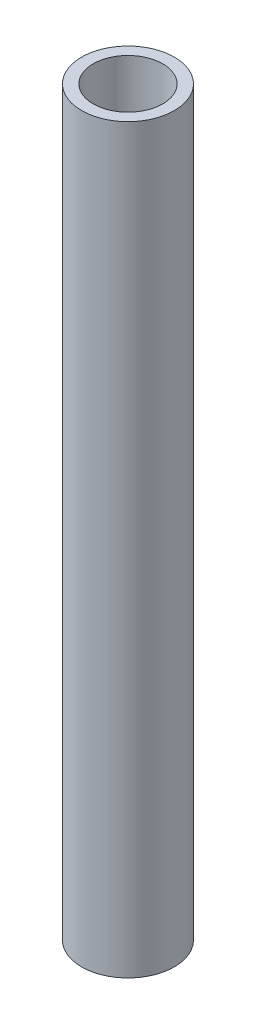
ISO-10303-21;
HEADER;
FILE_DESCRIPTION(('STEP AP214'),'2;1');
FILE_NAME('part.step','',(''),(''),'','','');
FILE_SCHEMA(('AUTOMOTIVE_DESIGN { 1 0 10303 214 1 1 1 1 }'));
ENDSEC;
DATA;
#1=APPLICATION_CONTEXT('core data for automotive mechanical design processes');
#2=APPLICATION_PROTOCOL_DEFINITION('international standard','automotive_design',2000,#1);
#3=PRODUCT_CONTEXT('',#1,'mechanical');
#4=PRODUCT('Part','Part','',(#3));
#5=PRODUCT_RELATED_PRODUCT_CATEGORY('part','',(#4));
#6=PRODUCT_DEFINITION_FORMATION('','',#4);
#7=PRODUCT_DEFINITION_CONTEXT('part definition',#1,'design');
#8=PRODUCT_DEFINITION('design','',#6,#7);
#9=PRODUCT_DEFINITION_SHAPE('','',#8);
#10=(LENGTH_UNIT() NAMED_UNIT(*) SI_UNIT(.MILLI.,.METRE.));
#11=(NAMED_UNIT(*) PLANE_ANGLE_UNIT() SI_UNIT($,.RADIAN.));
#12=(NAMED_UNIT(*) SI_UNIT($,.STERADIAN.) SOLID_ANGLE_UNIT());
#13=UNCERTAINTY_MEASURE_WITH_UNIT(LENGTH_MEASURE(1.E-05),#10,'distance_accuracy_value','');
#14=(GEOMETRIC_REPRESENTATION_CONTEXT(3) GLOBAL_UNCERTAINTY_ASSIGNED_CONTEXT((#13)) GLOBAL_UNIT_ASSIGNED_CONTEXT((#10,
#11,#12)) REPRESENTATION_CONTEXT('',''));
#15=CARTESIAN_POINT('',(0.,0.,0.));
#16=DIRECTION('',(0.,0.,1.));
#17=DIRECTION('',(1.,0.,0.));
#18=AXIS2_PLACEMENT_3D('',#15,#16,#17);
#19=CARTESIAN_POINT('',(0.,50.8,0.));
#20=DIRECTION('',(0.,1.,0.));
#21=DIRECTION('',(0.,0.,1.));
#22=AXIS2_PLACEMENT_3D('',#19,#20,#21);
#23=PLANE('',#22);
#24=CARTESIAN_POINT('',(0.,50.8,0.));
#25=DIRECTION('',(0.,1.,0.));
#26=DIRECTION('',(0.,0.,1.));
#27=AXIS2_PLACEMENT_3D('',#24,#25,#26);
#28=CIRCLE('',#27,3.175);
#29=CARTESIAN_POINT('',(0.,50.8,3.175));
#30=VERTEX_POINT('',#29);
#31=EDGE_CURVE('E43',#30,#30,#28,.T.);
#32=ORIENTED_EDGE('',*,*,#31,.T.);
#33=EDGE_LOOP('',(#32));
#34=FACE_BOUND('',#33,.T.);
#35=CARTESIAN_POINT('',(0.,50.8,0.));
#36=DIRECTION('',(0.,1.,0.));
#37=DIRECTION('',(0.,0.,1.));
#38=AXIS2_PLACEMENT_3D('',#35,#36,#37);
#39=CIRCLE('',#38,2.38125);
#40=CARTESIAN_POINT('',(0.,50.8,2.38125));
#41=VERTEX_POINT('',#40);
#42=EDGE_CURVE('E52',#41,#41,#39,.T.);
#43=ORIENTED_EDGE('',*,*,#42,.F.);
#44=EDGE_LOOP('',(#43));
#45=FACE_BOUND('',#44,.T.);
#46=ADVANCED_FACE('F32',(#34,#45),#23,.T.);
#47=CARTESIAN_POINT('',(0.,0.,0.));
#48=DIRECTION('',(0.,1.,0.));
#49=DIRECTION('',(0.,0.,1.));
#50=AXIS2_PLACEMENT_3D('',#47,#48,#49);
#51=PLANE('',#50);
#52=CARTESIAN_POINT('',(0.,0.,0.));
#53=DIRECTION('',(0.,1.,0.));
#54=DIRECTION('',(0.,0.,1.));
#55=AXIS2_PLACEMENT_3D('',#52,#53,#54);
#56=CIRCLE('',#55,3.175);
#57=CARTESIAN_POINT('',(0.,0.,3.175));
#58=VERTEX_POINT('',#57);
#59=EDGE_CURVE('E47',#58,#58,#56,.T.);
#60=ORIENTED_EDGE('',*,*,#59,.F.);
#61=EDGE_LOOP('',(#60));
#62=FACE_BOUND('',#61,.T.);
#63=CARTESIAN_POINT('',(0.,0.,0.));
#64=DIRECTION('',(0.,1.,0.));
#65=DIRECTION('',(0.,0.,1.));
#66=AXIS2_PLACEMENT_3D('',#63,#64,#65);
#67=CIRCLE('',#66,2.38125);
#68=CARTESIAN_POINT('',(0.,0.,2.38125));
#69=VERTEX_POINT('',#68);
#70=EDGE_CURVE('E54',#69,#69,#67,.T.);
#71=ORIENTED_EDGE('',*,*,#70,.T.);
#72=EDGE_LOOP('',(#71));
#73=FACE_BOUND('',#72,.T.);
#74=ADVANCED_FACE('F78',(#62,#73),#51,.F.);
#75=CARTESIAN_POINT('',(0.,50.8,0.));
#76=DIRECTION('',(0.,-1.,0.));
#77=DIRECTION('',(0.,0.,-1.));
#78=AXIS2_PLACEMENT_3D('',#75,#76,#77);
#79=CYLINDRICAL_SURFACE('',#78,3.175);
#80=CARTESIAN_POINT('',(-2.74882770949687,3.17502462022635,1.58888993435739));
#81=CARTESIAN_POINT('',(-2.74883491921362,3.09230347471639,1.5888841643825));
#82=CARTESIAN_POINT('',(-2.75262068652012,3.00947787943034,1.5823830546891));
#83=CARTESIAN_POINT('',(-2.76721589163253,2.84636883755137,1.55670982251439));
#84=CARTESIAN_POINT('',(-2.7780400875779,2.76609110509494,1.53751107424158));
#85=CARTESIAN_POINT('',(-2.80514420858386,2.61074510308035,1.48747706202258));
#86=CARTESIAN_POINT('',(-2.82139508162169,2.53565160942453,1.45670365510467));
#87=CARTESIAN_POINT('',(-2.85747766275996,2.39171369955656,1.38458203519406));
#88=CARTESIAN_POINT('',(-2.87730956456201,2.3228696216847,1.34323325011768));
#89=CARTESIAN_POINT('',(-2.9203201526704,2.18711427614131,1.24713472561136));
#90=CARTESIAN_POINT('',(-2.94363996616437,2.1208307423446,1.1915609826474));
#91=CARTESIAN_POINT('',(-2.98986449365632,1.9980388036307,1.0703021492032));
#92=CARTESIAN_POINT('',(-3.01276899553175,1.94153527462502,1.00461204578224));
#93=CARTESIAN_POINT('',(-3.05743176100581,1.83617926777944,0.859573044746663));
#94=CARTESIAN_POINT('',(-3.0790086877116,1.78809926374935,0.779601923860705));
#95=CARTESIAN_POINT('',(-3.11675953177772,1.70636351569871,0.611425105319753));
#96=CARTESIAN_POINT('',(-3.13293685752017,1.6726986686086,0.523224647423842));
#97=CARTESIAN_POINT('',(-3.15705191672915,1.62323597041086,0.347742511092332));
#98=CARTESIAN_POINT('',(-3.1654940285523,1.60633724713695,0.260842012003152));
#99=CARTESIAN_POINT('',(-3.17507779478834,1.58726090682973,0.0850611154821416));
#100=CARTESIAN_POINT('',(-3.17622386643338,1.58507438256317,-0.00381805128939768));
#101=CARTESIAN_POINT('',(-3.17132508379108,1.59505996515429,-0.172755820314771));
#102=CARTESIAN_POINT('',(-3.16589689086841,1.6059999698663,-0.252909346073254));
#103=CARTESIAN_POINT('',(-3.14939886525141,1.639722959925,-0.410068416331271));
#104=CARTESIAN_POINT('',(-3.13832861039716,1.66250683147611,-0.487073724803752));
#105=CARTESIAN_POINT('',(-3.11137137904733,1.71941819389394,-0.637093217187457));
#106=CARTESIAN_POINT('',(-3.09541988017657,1.75369826738701,-0.710037441860359));
#107=CARTESIAN_POINT('',(-3.06013991189908,1.83241779344623,-0.849316158809075));
#108=CARTESIAN_POINT('',(-3.04081023407293,1.87686088321884,-0.915648272466085));
#109=CARTESIAN_POINT('',(-2.99843423076338,1.97947099078502,-1.04650989497068));
#110=CARTESIAN_POINT('',(-2.97520929921116,2.0385381776939,-1.11027630243667));
#111=CARTESIAN_POINT('',(-2.92883357574234,2.16631080855301,-1.22741010742885));
#112=CARTESIAN_POINT('',(-2.90568285422064,2.23502359871143,-1.2807695041394));
#113=CARTESIAN_POINT('',(-2.86048597408261,2.38547862569959,-1.37889371234333));
#114=CARTESIAN_POINT('',(-2.83860332029404,2.46777118182492,-1.42289755001501));
#115=CARTESIAN_POINT('',(-2.80071701958443,2.63993817350876,-1.49610331799885));
#116=CARTESIAN_POINT('',(-2.78470724284475,2.72980458264173,-1.52532069385372));
#117=CARTESIAN_POINT('',(-2.76216304768593,2.90707765688778,-1.56575231183522));
#118=CARTESIAN_POINT('',(-2.75497828789955,2.99411489670799,-1.57820974220642));
#119=CARTESIAN_POINT('',(-2.74905043224157,3.16931174988386,-1.58851851186402));
#120=CARTESIAN_POINT('',(-2.7503013733165,3.25747052645402,-1.58638016864147));
#121=CARTESIAN_POINT('',(-2.76041353637987,3.42212521597008,-1.56869933052269));
#122=CARTESIAN_POINT('',(-2.76842729288886,3.49884199886019,-1.55464871741576));
#123=CARTESIAN_POINT('',(-2.78990927379191,3.6486834809315,-1.51575754457271));
#124=CARTESIAN_POINT('',(-2.80337926449891,3.72180700828659,-1.49091349055369));
#125=CARTESIAN_POINT('',(-2.83498582213927,3.86624010803438,-1.42993243920374));
#126=CARTESIAN_POINT('',(-2.85330962809472,3.93730880948136,-1.39332569971757));
#127=CARTESIAN_POINT('',(-2.89239120223534,4.0727070887945,-1.3102685685522));
#128=CARTESIAN_POINT('',(-2.91315021829215,4.13703317930369,-1.26381312018282));
#129=CARTESIAN_POINT('',(-2.95790655941964,4.26560341366998,-1.15553371482659));
#130=CARTESIAN_POINT('',(-2.98198223185818,4.32881509699063,-1.09251065164959));
#131=CARTESIAN_POINT('',(-3.02838988340399,4.44409154804117,-0.956373688470212));
#132=CARTESIAN_POINT('',(-3.05072127189845,4.49615255046733,-0.883256393563637));
#133=CARTESIAN_POINT('',(-3.09188674044136,4.58881041017213,-0.726361808436089));
#134=CARTESIAN_POINT('',(-3.1106129655641,4.62906844538617,-0.642354109574931));
#135=CARTESIAN_POINT('',(-3.14163504360348,4.69448104259996,-0.467553489798921));
#136=CARTESIAN_POINT('',(-3.15393654172063,4.71964886677036,-0.376766605991209));
#137=CARTESIAN_POINT('',(-3.16982320069078,4.75199721585362,-0.199977696281177));
#138=CARTESIAN_POINT('',(-3.17410454859489,4.76061624817968,-0.114300942213469));
#139=CARTESIAN_POINT('',(-3.17564022186957,4.76386330413521,0.0573680259302063));
#140=CARTESIAN_POINT('',(-3.17289700715075,4.7584962255075,0.143360119047536));
#141=CARTESIAN_POINT('',(-3.16109682104474,4.73487607443829,0.307252265230391));
#142=CARTESIAN_POINT('',(-3.15246780257241,4.71749542202979,0.385312154335311));
#143=CARTESIAN_POINT('',(-3.13015325402427,4.67151800883288,0.537278036704094));
#144=CARTESIAN_POINT('',(-3.11646699882652,4.64291963957799,0.611183432532456));
#145=CARTESIAN_POINT('',(-3.08454218339078,4.57404542491286,0.756294213320669));
#146=CARTESIAN_POINT('',(-3.06613395570349,4.5333224446339,0.827248922320375));
#147=CARTESIAN_POINT('',(-3.02668833697277,4.4419164049876,0.961610076721102));
#148=CARTESIAN_POINT('',(-3.00564973998932,4.39122877100521,1.02501303368252));
#149=CARTESIAN_POINT('',(-2.96056110094025,4.27548416202781,1.14912290630251));
#150=CARTESIAN_POINT('',(-2.93641973120936,4.2094991713563,1.20893355134433));
#151=CARTESIAN_POINT('',(-2.88958588277424,4.06807160043283,1.31696403178478));
#152=CARTESIAN_POINT('',(-2.86689469882726,3.9926207420989,1.3651736128127));
#153=CARTESIAN_POINT('',(-2.82501105944426,3.83123894377908,1.44991277195113));
#154=CARTESIAN_POINT('',(-2.80595183171966,3.74505216455948,1.48602509380099));
#155=CARTESIAN_POINT('',(-2.77522065345828,3.56660942833695,1.54267322333504));
#156=CARTESIAN_POINT('',(-2.76352401792065,3.47437490907746,1.56326112712008));
#157=CARTESIAN_POINT('',(-2.75397877539454,3.3467836181288,1.57995016243613));
#158=CARTESIAN_POINT('',(-2.75205392829055,3.31255308786971,1.58329738135979));
#159=CARTESIAN_POINT('',(-2.74947685172674,3.24389595714329,1.58776854298275));
#160=CARTESIAN_POINT('',(-2.74882470740232,3.20946934371377,1.58889233694971));
#161=CARTESIAN_POINT('',(-2.74882770949687,3.17502462022635,1.58888993435739));
#162=B_SPLINE_CURVE_WITH_KNOTS('',3,(#80,#81,#82,#83,#84,#85,#86,#87,#88,#89,#90,#91,#92,#93,
#94,#95,#96,#97,#98,#99,#100,#101,#102,#103,#104,#105,#106,#107,#108,#109,#110,#111,#112,#113,
#114,#115,#116,#117,#118,#119,#120,#121,#122,#123,#124,#125,#126,#127,#128,#129,#130,#131,#132,
#133,#134,#135,#136,#137,#138,#139,#140,#141,#142,#143,#144,#145,#146,#147,#148,#149,#150,#151,
#152,#153,#154,#155,#156,#157,#158,#159,#160,#161),.UNSPECIFIED.,.T.,.F.,(4,2,2,2,2,2,2,2,2,2,2,
2,2,2,2,2,2,2,2,2,2,2,2,2,2,2,2,2,2,2,2,2,2,2,2,2,2,2,2,2,4),(0.,0.24801849461911,
0.496558717359376,0.743789146021229,0.991032951644172,1.25866892109094,1.52643794096439,
1.81225653929036,2.09789437805176,2.36320782386596,2.62836062601588,2.87045554756704,
3.11256858621459,3.35803136385694,3.60358212718556,3.87234416437813,4.14131201590394,
4.42736036245498,4.7131092906108,4.9762138673106,5.23913247936541,5.47329016185639,
5.70752370742248,5.95260583044662,6.19781409374323,6.47393205434221,6.75014310652894,
7.03364387993081,7.31689512946423,7.57415729243308,7.83132937785428,8.07155524483492,
8.31181556950318,8.56235191767159,8.81300355284889,9.08860008936979,9.36443934266679,
9.64899564098782,9.93259273641879,10.0358596460668,10.1391334633508),.UNSPECIFIED.);
#163=CARTESIAN_POINT('',(-2.74882770949687,3.17502462022635,1.58888993435739));
#164=VERTEX_POINT('',#163);
#165=EDGE_CURVE('E10',#164,#164,#162,.T.);
#166=ORIENTED_EDGE('',*,*,#165,.T.);
#167=EDGE_LOOP('',(#166));
#168=FACE_BOUND('',#167,.T.);
#169=ORIENTED_EDGE('',*,*,#31,.F.);
#170=EDGE_LOOP('',(#169));
#171=FACE_BOUND('',#170,.T.);
#172=ORIENTED_EDGE('',*,*,#59,.T.);
#173=EDGE_LOOP('',(#172));
#174=FACE_BOUND('',#173,.T.);
#175=ADVANCED_FACE('F34',(#168,#171,#174),#79,.T.);
#176=CARTESIAN_POINT('',(0.,50.8,0.));
#177=DIRECTION('',(0.,-1.,0.));
#178=DIRECTION('',(0.,0.,-1.));
#179=AXIS2_PLACEMENT_3D('',#176,#177,#178);
#180=CYLINDRICAL_SURFACE('',#179,2.38125);
#181=CARTESIAN_POINT('',(-1.77407613419667,3.17502462022635,1.58839712684637));
#182=CARTESIAN_POINT('',(-1.77408372235744,3.09753214847438,1.58839279678917));
#183=CARTESIAN_POINT('',(-1.77924850872367,3.02001258446999,1.58267674412269));
#184=CARTESIAN_POINT('',(-1.79889641851791,2.86774819035352,1.5602971764767));
#185=CARTESIAN_POINT('',(-1.81339625588081,2.79300859202476,1.54361402433063));
#186=CARTESIAN_POINT('',(-1.84912821763252,2.64897836323594,1.5006134619442));
#187=CARTESIAN_POINT('',(-1.87029472516054,2.57964251094084,1.47438958197332));
#188=CARTESIAN_POINT('',(-1.91685946075183,2.44646861580119,1.41332048339744));
#189=CARTESIAN_POINT('',(-1.94225856728098,2.38263171843253,1.37847347435283));
#190=CARTESIAN_POINT('',(-1.99916757281533,2.25137990318043,1.2948425187742));
#191=CARTESIAN_POINT('',(-2.03101326193804,2.18495475178833,1.24473350213208));
#192=CARTESIAN_POINT('',(-2.09448866825353,2.06059747005739,1.13468661727198));
#193=CARTESIAN_POINT('',(-2.12611814366962,2.0026737124099,1.07473918100035));
#194=CARTESIAN_POINT('',(-2.19098192488538,1.88863871606841,0.936269862843662));
#195=CARTESIAN_POINT('',(-2.22378809229139,1.83399787650442,0.856315756696874));
#196=CARTESIAN_POINT('',(-2.28214907095415,1.73941495693111,0.685740206959136));
#197=CARTESIAN_POINT('',(-2.30771197581846,1.6994564559641,0.595130831088971));
#198=CARTESIAN_POINT('',(-2.34611398680121,1.64026422691875,0.416515135676053));
#199=CARTESIAN_POINT('',(-2.36005874425882,1.61920846553301,0.329357035658943));
#200=CARTESIAN_POINT('',(-2.37807592625733,1.59214068185746,0.151773071269095));
#201=CARTESIAN_POINT('',(-2.38216078357675,1.58610971384116,0.0613514682452848));
#202=CARTESIAN_POINT('',(-2.38015546244527,1.58924900237342,-0.105275893777436));
#203=CARTESIAN_POINT('',(-2.37551806926099,1.59624717970927,-0.181552533361043));
#204=CARTESIAN_POINT('',(-2.35925788904843,1.62093439224249,-0.331577931971545));
#205=CARTESIAN_POINT('',(-2.34763459258016,1.63862420711729,-0.40532650622719));
#206=CARTESIAN_POINT('',(-2.31844091116387,1.68372369503205,-0.548164793454911));
#207=CARTESIAN_POINT('',(-2.30089417607364,1.71109473535271,-0.617271743082294));
#208=CARTESIAN_POINT('',(-2.26114693974294,1.77449532432016,-0.749910435791092));
#209=CARTESIAN_POINT('',(-2.23894558910415,1.81052645348068,-0.813441158287724));
#210=CARTESIAN_POINT('',(-2.18819491553419,1.89548274308515,-0.942094486293836));
#211=CARTESIAN_POINT('',(-2.15919479297649,1.94548009188763,-1.00632923745881));
#212=CARTESIAN_POINT('',(-2.09924934724042,2.05416919706386,-1.12605435599633));
#213=CARTESIAN_POINT('',(-2.06830106669025,2.11287436481132,-1.18153095747427));
#214=CARTESIAN_POINT('',(-2.00209392777207,2.24789541833315,-1.29099257955344));
#215=CARTESIAN_POINT('',(-1.966911856719,2.32553041474972,-1.34340865087378));
#216=CARTESIAN_POINT('',(-1.90156310487852,2.4904230551078,-1.43441562546621));
#217=CARTESIAN_POINT('',(-1.87138806132098,2.57766424079242,-1.4730297080124));
#218=CARTESIAN_POINT('',(-1.82848312696035,2.73427037574686,-1.52571676572806));
#219=CARTESIAN_POINT('',(-1.81323230126476,2.80163935770893,-1.54364788665489));
#220=CARTESIAN_POINT('',(-1.78997851277605,2.93931221526854,-1.57055795948681));
#221=CARTESIAN_POINT('',(-1.78196298523822,3.00961078034487,-1.5795524334288));
#222=CARTESIAN_POINT('',(-1.77441807295771,3.15156374071404,-1.58802709491323));
#223=CARTESIAN_POINT('',(-1.77492560577427,3.22322269067578,-1.5874658919811));
#224=CARTESIAN_POINT('',(-1.78443207402888,3.36527366342909,-1.57676847786307));
#225=CARTESIAN_POINT('',(-1.79343789256738,3.43566461211503,-1.5666245052026));
#226=CARTESIAN_POINT('',(-1.81789370536617,3.56982747040327,-1.53816087108084));
#227=CARTESIAN_POINT('',(-1.83300726062008,3.63375473923523,-1.52026498684089));
#228=CARTESIAN_POINT('',(-1.8678848666375,3.7577373201032,-1.47720123075545));
#229=CARTESIAN_POINT('',(-1.88765047879096,3.81779132349768,-1.45203091671372));
#230=CARTESIAN_POINT('',(-1.93436883122367,3.94512246072415,-1.38938127784983));
#231=CARTESIAN_POINT('',(-1.96196845923467,4.01144408916549,-1.3504472345368));
#232=CARTESIAN_POINT('',(-2.01884793360423,4.13738045707575,-1.2638417943323));
#233=CARTESIAN_POINT('',(-2.04812979552419,4.19698688657431,-1.21615975951799));
#234=CARTESIAN_POINT('',(-2.11253273578583,4.32116973361042,-1.1012655731103));
#235=CARTESIAN_POINT('',(-2.14753208297881,4.38398750604518,-1.03206246698547));
#236=CARTESIAN_POINT('',(-2.21322758281104,4.4972666122885,-0.882403885241281));
#237=CARTESIAN_POINT('',(-2.24392752720998,4.54773886365614,-0.801958451257106));
#238=CARTESIAN_POINT('',(-2.29260490677178,4.62591368799642,-0.647721688257226));
#239=CARTESIAN_POINT('',(-2.31189338651938,4.65612759562702,-0.575619496312039));
#240=CARTESIAN_POINT('',(-2.34399064632864,4.70585658071706,-0.426453429107375));
#241=CARTESIAN_POINT('',(-2.35680489841266,4.72538069437098,-0.349393806192005));
#242=CARTESIAN_POINT('',(-2.37482562463077,4.75275908527366,-0.191973833494871));
#243=CARTESIAN_POINT('',(-2.37999823617056,4.76056142208485,-0.111600404761654));
#244=CARTESIAN_POINT('',(-2.38209697876668,4.76383260228859,0.0495084188015385));
#245=CARTESIAN_POINT('',(-2.3790238763419,4.75930259209154,0.130243779289931));
#246=CARTESIAN_POINT('',(-2.36546653343491,4.73898240082888,0.283578492168532));
#247=CARTESIAN_POINT('',(-2.35553740693559,4.72403490099229,0.35634258494409));
#248=CARTESIAN_POINT('',(-2.32969132527094,4.68454820024056,0.498080014435713));
#249=CARTESIAN_POINT('',(-2.3137734399357,4.66000750929445,0.5670527603741));
#250=CARTESIAN_POINT('',(-2.27605413972855,4.60064827322465,0.703736466669794));
#251=CARTESIAN_POINT('',(-2.25396558274298,4.56531718865212,0.771143490165616));
#252=CARTESIAN_POINT('',(-2.20597543100019,4.48618004605447,0.899285321125462));
#253=CARTESIAN_POINT('',(-2.18007155688858,4.44236891691444,0.960016101914287));
#254=CARTESIAN_POINT('',(-2.12188403499124,4.33975042899689,1.08318769306236));
#255=CARTESIAN_POINT('',(-2.08923775884736,4.27966822018507,1.14439517584484));
#256=CARTESIAN_POINT('',(-2.02385107451584,4.15045324662433,1.25641854058354));
#257=CARTESIAN_POINT('',(-1.9911106143271,4.08131377408928,1.30722664861637));
#258=CARTESIAN_POINT('',(-1.93115761720398,3.94030472006433,1.39411296787398));
#259=CARTESIAN_POINT('',(-1.90371388539864,3.86904643357825,1.43101953274284));
#260=CARTESIAN_POINT('',(-1.85461565170209,3.72010508883802,1.49410701442527));
#261=CARTESIAN_POINT('',(-1.83294993157845,3.64243486947326,1.52030876846695));
#262=CARTESIAN_POINT('',(-1.80254245581065,3.49984976716436,1.5561555978739));
#263=CARTESIAN_POINT('',(-1.79200048124283,3.43592370727404,1.56818324902998));
#264=CARTESIAN_POINT('',(-1.77776693139764,3.30634547732587,1.58430257410083));
#265=CARTESIAN_POINT('',(-1.77406970369192,3.24069477696951,1.5884007963065));
#266=CARTESIAN_POINT('',(-1.77407613419667,3.17502462022635,1.58839712684637));
#267=B_SPLINE_CURVE_WITH_KNOTS('',3,(#181,#182,#183,#184,#185,#186,#187,#188,#189,#190,#191,
#192,#193,#194,#195,#196,#197,#198,#199,#200,#201,#202,#203,#204,#205,#206,#207,#208,#209,#210,
#211,#212,#213,#214,#215,#216,#217,#218,#219,#220,#221,#222,#223,#224,#225,#226,#227,#228,#229,
#230,#231,#232,#233,#234,#235,#236,#237,#238,#239,#240,#241,#242,#243,#244,#245,#246,#247,#248,
#249,#250,#251,#252,#253,#254,#255,#256,#257,#258,#259,#260,#261,#262,#263,#264,#265,#266),
.UNSPECIFIED.,.T.,.F.,(4,2,2,2,2,2,2,2,2,2,2,2,2,2,2,2,2,2,2,2,2,2,2,2,2,2,2,2,2,2,2,2,2,2,2,2,
2,2,2,2,2,2,4),(0.,0.232177376260708,0.464771614793309,0.695144541902916,0.925565342053231,
1.19185274923231,1.45840067758793,1.76345080861242,2.06815872077185,2.33868501387965,
2.60887000996336,2.83797005871119,3.06708681637722,3.29529941628719,3.52355369791755,
3.7818022372014,4.0404527299483,4.33926220907048,4.63756747859257,4.8508133425605,
5.06368816949416,5.2774852987519,5.4914557395916,5.69496933542379,5.89855133505683,
6.14282513853048,6.38739798209887,6.68539655837204,6.98313064390675,7.22368523359224,
7.46403616478914,7.70544900728707,7.94683940890317,8.17067820909411,8.39455179013628,
8.63137928743747,8.86834884893989,9.14258876237022,9.41703293768456,9.67052712349835,
9.92352549714011,10.1204443919019,10.3172005973312),.UNSPECIFIED.);
#268=CARTESIAN_POINT('',(-1.77407613419667,3.17502462022635,1.58839712684637));
#269=VERTEX_POINT('',#268);
#270=EDGE_CURVE('E57',#269,#269,#267,.T.);
#271=ORIENTED_EDGE('',*,*,#270,.F.);
#272=EDGE_LOOP('',(#271));
#273=FACE_BOUND('',#272,.T.);
#274=ORIENTED_EDGE('',*,*,#42,.T.);
#275=EDGE_LOOP('',(#274));
#276=FACE_BOUND('',#275,.T.);
#277=ORIENTED_EDGE('',*,*,#70,.F.);
#278=EDGE_LOOP('',(#277));
#279=FACE_BOUND('',#278,.T.);
#280=ADVANCED_FACE('F64',(#273,#276,#279),#180,.F.);
#281=CARTESIAN_POINT('',(-3.17499959422957,3.17502462022635,0.00160519222245845));
#282=DIRECTION('',(-0.99999987219829,0.,0.000505572353530276));
#283=DIRECTION('',(0.000505572353530276,0.,0.99999987219829));
#284=AXIS2_PLACEMENT_3D('',#281,#282,#283);
#285=CYLINDRICAL_SURFACE('',#284,1.58749999999999);
#286=ORIENTED_EDGE('',*,*,#270,.T.);
#287=EDGE_LOOP('',(#286));
#288=FACE_BOUND('',#287,.T.);
#289=ORIENTED_EDGE('',*,*,#165,.F.);
#290=EDGE_LOOP('',(#289));
#291=FACE_BOUND('',#290,.T.);
#292=ADVANCED_FACE('F67',(#288,#291),#285,.F.);
#293=CLOSED_SHELL('',(#46,#74,#175,#280,#292));
#294=MANIFOLD_SOLID_BREP('B2',#293);
#295=ADVANCED_BREP_SHAPE_REPRESENTATION('',(#18,#294),#14);
#296=SHAPE_DEFINITION_REPRESENTATION(#9,#295);
ENDSEC;
END-ISO-10303-21;
